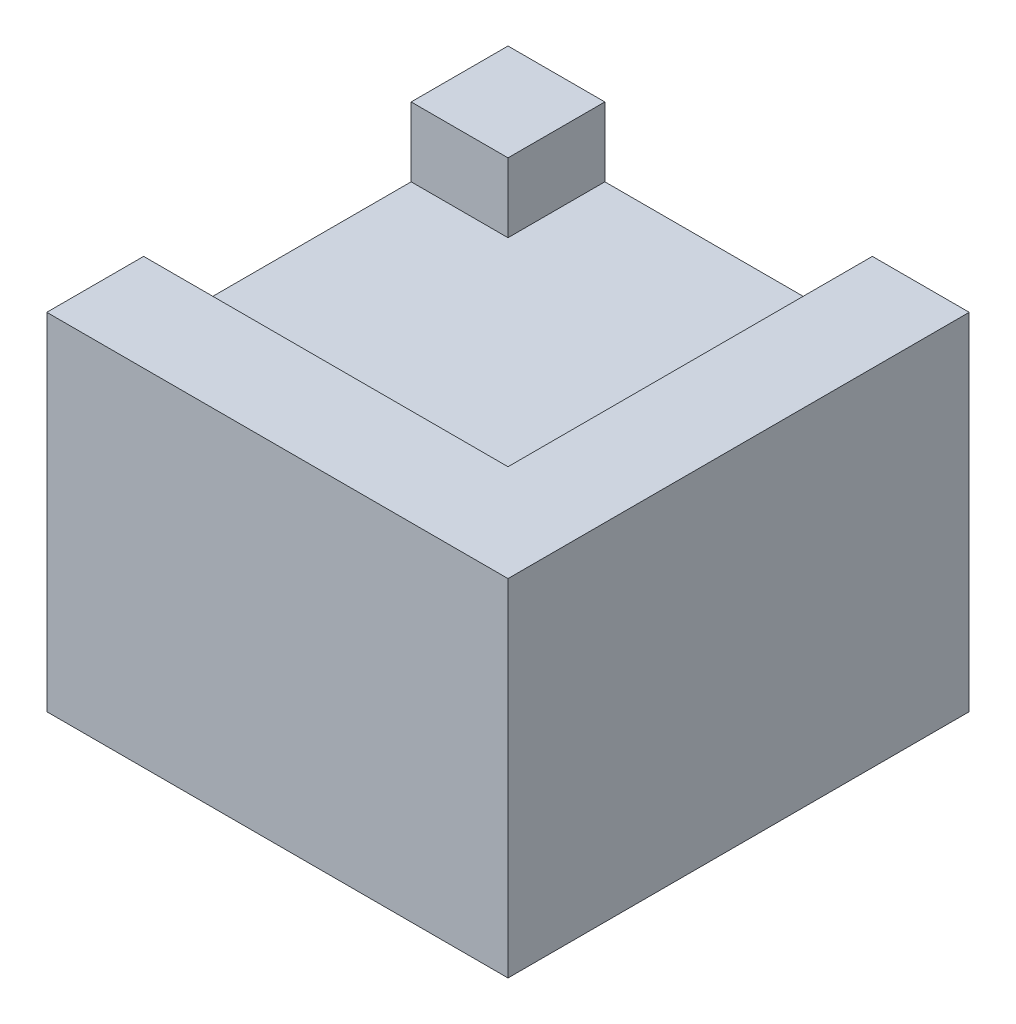
ISO-10303-21;
HEADER;
FILE_DESCRIPTION(('STEP AP214'),'2;1');
FILE_NAME('part.step','',(''),(''),'','','');
FILE_SCHEMA(('AUTOMOTIVE_DESIGN { 1 0 10303 214 1 1 1 1 }'));
ENDSEC;
DATA;
#1=APPLICATION_CONTEXT('core data for automotive mechanical design processes');
#2=APPLICATION_PROTOCOL_DEFINITION('international standard','automotive_design',2000,#1);
#3=PRODUCT_CONTEXT('',#1,'mechanical');
#4=PRODUCT('Part','Part','',(#3));
#5=PRODUCT_RELATED_PRODUCT_CATEGORY('part','',(#4));
#6=PRODUCT_DEFINITION_FORMATION('','',#4);
#7=PRODUCT_DEFINITION_CONTEXT('part definition',#1,'design');
#8=PRODUCT_DEFINITION('design','',#6,#7);
#9=PRODUCT_DEFINITION_SHAPE('','',#8);
#10=(LENGTH_UNIT() NAMED_UNIT(*) SI_UNIT(.MILLI.,.METRE.));
#11=(NAMED_UNIT(*) PLANE_ANGLE_UNIT() SI_UNIT($,.RADIAN.));
#12=(NAMED_UNIT(*) SI_UNIT($,.STERADIAN.) SOLID_ANGLE_UNIT());
#13=UNCERTAINTY_MEASURE_WITH_UNIT(LENGTH_MEASURE(1.E-05),#10,'distance_accuracy_value','');
#14=(GEOMETRIC_REPRESENTATION_CONTEXT(3) GLOBAL_UNCERTAINTY_ASSIGNED_CONTEXT((#13)) GLOBAL_UNIT_ASSIGNED_CONTEXT((#10,
#11,#12)) REPRESENTATION_CONTEXT('',''));
#15=CARTESIAN_POINT('',(0.,0.,0.));
#16=DIRECTION('',(0.,0.,1.));
#17=DIRECTION('',(1.,0.,0.));
#18=AXIS2_PLACEMENT_3D('',#15,#16,#17);
#19=CARTESIAN_POINT('',(0.,19.05,0.));
#20=DIRECTION('',(0.,1.,0.));
#21=DIRECTION('',(0.,0.,1.));
#22=AXIS2_PLACEMENT_3D('',#19,#20,#21);
#23=PLANE('',#22);
#24=DIRECTION('',(-1.,0.,0.));
#25=VECTOR('',#24,1.);
#26=CARTESIAN_POINT('',(-15.875,19.05,9.2075));
#27=LINE('',#26,#25);
#28=CARTESIAN_POINT('',(9.2075,19.05,9.2075));
#29=VERTEX_POINT('',#28);
#30=CARTESIAN_POINT('',(-15.875,19.05,9.2075));
#31=VERTEX_POINT('',#30);
#32=EDGE_CURVE('E137',#29,#31,#27,.T.);
#33=ORIENTED_EDGE('',*,*,#32,.F.);
#34=DIRECTION('',(0.,0.,1.));
#35=VECTOR('',#34,1.);
#36=CARTESIAN_POINT('',(9.2075,19.05,9.2075));
#37=LINE('',#36,#35);
#38=CARTESIAN_POINT('',(9.2075,19.05,-15.875));
#39=VERTEX_POINT('',#38);
#40=EDGE_CURVE('E139',#39,#29,#37,.T.);
#41=ORIENTED_EDGE('',*,*,#40,.F.);
#42=DIRECTION('',(-1.,0.,0.));
#43=VECTOR('',#42,1.);
#44=CARTESIAN_POINT('',(-15.875,19.05,-15.875));
#45=LINE('',#44,#43);
#46=CARTESIAN_POINT('',(-9.2075,19.05,-15.875));
#47=VERTEX_POINT('',#46);
#48=EDGE_CURVE('E177',#39,#47,#45,.T.);
#49=ORIENTED_EDGE('',*,*,#48,.T.);
#50=DIRECTION('',(0.,0.,-1.));
#51=VECTOR('',#50,1.);
#52=CARTESIAN_POINT('',(-9.2075,19.05,-15.875));
#53=LINE('',#52,#51);
#54=CARTESIAN_POINT('',(-9.2075,19.05,-9.2075));
#55=VERTEX_POINT('',#54);
#56=EDGE_CURVE('E158',#55,#47,#53,.T.);
#57=ORIENTED_EDGE('',*,*,#56,.F.);
#58=DIRECTION('',(1.,0.,0.));
#59=VECTOR('',#58,1.);
#60=CARTESIAN_POINT('',(-9.2075,19.05,-9.2075));
#61=LINE('',#60,#59);
#62=CARTESIAN_POINT('',(-15.875,19.05,-9.2075));
#63=VERTEX_POINT('',#62);
#64=EDGE_CURVE('E56',#63,#55,#61,.T.);
#65=ORIENTED_EDGE('',*,*,#64,.F.);
#66=DIRECTION('',(0.,0.,1.));
#67=VECTOR('',#66,1.);
#68=CARTESIAN_POINT('',(-15.875,19.05,-15.875));
#69=LINE('',#68,#67);
#70=EDGE_CURVE('E179',#63,#31,#69,.T.);
#71=ORIENTED_EDGE('',*,*,#70,.T.);
#72=EDGE_LOOP('',(#33,#41,#49,#57,#65,#71));
#73=FACE_BOUND('',#72,.T.);
#74=ADVANCED_FACE('F33',(#73),#23,.T.);
#75=CARTESIAN_POINT('',(15.875,19.05,-15.875));
#76=DIRECTION('',(-1.,0.,0.));
#77=DIRECTION('',(0.,0.,1.));
#78=AXIS2_PLACEMENT_3D('',#75,#76,#77);
#79=PLANE('',#78);
#80=DIRECTION('',(0.,0.,-1.));
#81=VECTOR('',#80,1.);
#82=CARTESIAN_POINT('',(15.875,0.,-15.875));
#83=LINE('',#82,#81);
#84=CARTESIAN_POINT('',(15.875,0.,15.875));
#85=VERTEX_POINT('',#84);
#86=CARTESIAN_POINT('',(15.875,0.,-15.875));
#87=VERTEX_POINT('',#86);
#88=EDGE_CURVE('E176',#85,#87,#83,.T.);
#89=ORIENTED_EDGE('',*,*,#88,.T.);
#90=DIRECTION('',(0.,-1.,0.));
#91=VECTOR('',#90,1.);
#92=CARTESIAN_POINT('',(15.875,19.05,-15.875));
#93=LINE('',#92,#91);
#94=CARTESIAN_POINT('',(15.875,23.8125,-15.875));
#95=VERTEX_POINT('',#94);
#96=EDGE_CURVE('E11',#95,#87,#93,.T.);
#97=ORIENTED_EDGE('',*,*,#96,.F.);
#98=DIRECTION('',(0.,0.,-1.));
#99=VECTOR('',#98,1.);
#100=CARTESIAN_POINT('',(15.875,23.8125,-15.875));
#101=LINE('',#100,#99);
#102=CARTESIAN_POINT('',(15.875,23.8125,15.875));
#103=VERTEX_POINT('',#102);
#104=EDGE_CURVE('E132',#103,#95,#101,.T.);
#105=ORIENTED_EDGE('',*,*,#104,.F.);
#106=DIRECTION('',(0.,-1.,0.));
#107=VECTOR('',#106,1.);
#108=CARTESIAN_POINT('',(15.875,19.05,15.875));
#109=LINE('',#108,#107);
#110=EDGE_CURVE('E123',#103,#85,#109,.T.);
#111=ORIENTED_EDGE('',*,*,#110,.T.);
#112=EDGE_LOOP('',(#89,#97,#105,#111));
#113=FACE_BOUND('',#112,.T.);
#114=ADVANCED_FACE('F35',(#113),#79,.F.);
#115=CARTESIAN_POINT('',(-15.875,19.05,-15.875));
#116=DIRECTION('',(0.,0.,1.));
#117=DIRECTION('',(1.,0.,0.));
#118=AXIS2_PLACEMENT_3D('',#115,#116,#117);
#119=PLANE('',#118);
#120=DIRECTION('',(-1.,0.,0.));
#121=VECTOR('',#120,1.);
#122=CARTESIAN_POINT('',(-15.875,0.,-15.875));
#123=LINE('',#122,#121);
#124=CARTESIAN_POINT('',(-15.875,0.,-15.875));
#125=VERTEX_POINT('',#124);
#126=EDGE_CURVE('E184',#87,#125,#123,.T.);
#127=ORIENTED_EDGE('',*,*,#126,.T.);
#128=DIRECTION('',(0.,-1.,0.));
#129=VECTOR('',#128,1.);
#130=CARTESIAN_POINT('',(-15.875,19.05,-15.875));
#131=LINE('',#130,#129);
#132=CARTESIAN_POINT('',(-15.875,23.8125,-15.875));
#133=VERTEX_POINT('',#132);
#134=EDGE_CURVE('E41',#133,#125,#131,.T.);
#135=ORIENTED_EDGE('',*,*,#134,.F.);
#136=DIRECTION('',(-1.,0.,0.));
#137=VECTOR('',#136,1.);
#138=CARTESIAN_POINT('',(-15.875,23.8125,-15.875));
#139=LINE('',#138,#137);
#140=CARTESIAN_POINT('',(-9.2075,23.8125,-15.875));
#141=VERTEX_POINT('',#140);
#142=EDGE_CURVE('E154',#141,#133,#139,.T.);
#143=ORIENTED_EDGE('',*,*,#142,.F.);
#144=DIRECTION('',(0.,-1.,0.));
#145=VECTOR('',#144,1.);
#146=CARTESIAN_POINT('',(-9.2075,23.8125,-15.875));
#147=LINE('',#146,#145);
#148=EDGE_CURVE('E164',#141,#47,#147,.T.);
#149=ORIENTED_EDGE('',*,*,#148,.T.);
#150=ORIENTED_EDGE('',*,*,#48,.F.);
#151=DIRECTION('',(0.,-1.,0.));
#152=VECTOR('',#151,1.);
#153=CARTESIAN_POINT('',(9.2075,23.8125,-15.875));
#154=LINE('',#153,#152);
#155=CARTESIAN_POINT('',(9.2075,23.8125,-15.875));
#156=VERTEX_POINT('',#155);
#157=EDGE_CURVE('E152',#156,#39,#154,.T.);
#158=ORIENTED_EDGE('',*,*,#157,.F.);
#159=DIRECTION('',(-1.,0.,0.));
#160=VECTOR('',#159,1.);
#161=CARTESIAN_POINT('',(9.2075,23.8125,-15.875));
#162=LINE('',#161,#160);
#163=EDGE_CURVE('E143',#95,#156,#162,.T.);
#164=ORIENTED_EDGE('',*,*,#163,.F.);
#165=ORIENTED_EDGE('',*,*,#96,.T.);
#166=EDGE_LOOP('',(#127,#135,#143,#149,#150,#158,#164,#165));
#167=FACE_BOUND('',#166,.T.);
#168=ADVANCED_FACE('F198',(#167),#119,.F.);
#169=CARTESIAN_POINT('',(-15.875,19.05,-15.875));
#170=DIRECTION('',(1.,0.,0.));
#171=DIRECTION('',(0.,0.,-1.));
#172=AXIS2_PLACEMENT_3D('',#169,#170,#171);
#173=PLANE('',#172);
#174=DIRECTION('',(0.,0.,1.));
#175=VECTOR('',#174,1.);
#176=CARTESIAN_POINT('',(-15.875,0.,-15.875));
#177=LINE('',#176,#175);
#178=CARTESIAN_POINT('',(-15.875,0.,15.875));
#179=VERTEX_POINT('',#178);
#180=EDGE_CURVE('E120',#125,#179,#177,.T.);
#181=ORIENTED_EDGE('',*,*,#180,.T.);
#182=DIRECTION('',(0.,-1.,0.));
#183=VECTOR('',#182,1.);
#184=CARTESIAN_POINT('',(-15.875,19.05,15.875));
#185=LINE('',#184,#183);
#186=CARTESIAN_POINT('',(-15.875,23.8125,15.875));
#187=VERTEX_POINT('',#186);
#188=EDGE_CURVE('E112',#187,#179,#185,.T.);
#189=ORIENTED_EDGE('',*,*,#188,.F.);
#190=DIRECTION('',(0.,0.,1.));
#191=VECTOR('',#190,1.);
#192=CARTESIAN_POINT('',(-15.875,23.8125,15.875));
#193=LINE('',#192,#191);
#194=CARTESIAN_POINT('',(-15.875,23.8125,9.2075));
#195=VERTEX_POINT('',#194);
#196=EDGE_CURVE('E117',#195,#187,#193,.T.);
#197=ORIENTED_EDGE('',*,*,#196,.F.);
#198=DIRECTION('',(0.,-1.,0.));
#199=VECTOR('',#198,1.);
#200=CARTESIAN_POINT('',(-15.875,23.8125,9.2075));
#201=LINE('',#200,#199);
#202=EDGE_CURVE('E148',#195,#31,#201,.T.);
#203=ORIENTED_EDGE('',*,*,#202,.T.);
#204=ORIENTED_EDGE('',*,*,#70,.F.);
#205=DIRECTION('',(0.,-1.,0.));
#206=VECTOR('',#205,1.);
#207=CARTESIAN_POINT('',(-15.875,23.8125,-9.2075));
#208=LINE('',#207,#206);
#209=CARTESIAN_POINT('',(-15.875,23.8125,-9.2075));
#210=VERTEX_POINT('',#209);
#211=EDGE_CURVE('E173',#210,#63,#208,.T.);
#212=ORIENTED_EDGE('',*,*,#211,.F.);
#213=DIRECTION('',(0.,0.,1.));
#214=VECTOR('',#213,1.);
#215=CARTESIAN_POINT('',(-15.875,23.8125,-9.2075));
#216=LINE('',#215,#214);
#217=EDGE_CURVE('E157',#133,#210,#216,.T.);
#218=ORIENTED_EDGE('',*,*,#217,.F.);
#219=ORIENTED_EDGE('',*,*,#134,.T.);
#220=EDGE_LOOP('',(#181,#189,#197,#203,#204,#212,#218,#219));
#221=FACE_BOUND('',#220,.T.);
#222=ADVANCED_FACE('F114',(#221),#173,.F.);
#223=CARTESIAN_POINT('',(-15.875,19.05,15.875));
#224=DIRECTION('',(0.,0.,-1.));
#225=DIRECTION('',(-1.,0.,0.));
#226=AXIS2_PLACEMENT_3D('',#223,#224,#225);
#227=PLANE('',#226);
#228=DIRECTION('',(1.,0.,0.));
#229=VECTOR('',#228,1.);
#230=CARTESIAN_POINT('',(-15.875,0.,15.875));
#231=LINE('',#230,#229);
#232=EDGE_CURVE('E180',#179,#85,#231,.T.);
#233=ORIENTED_EDGE('',*,*,#232,.T.);
#234=ORIENTED_EDGE('',*,*,#110,.F.);
#235=DIRECTION('',(1.,0.,0.));
#236=VECTOR('',#235,1.);
#237=CARTESIAN_POINT('',(15.875,23.8125,15.875));
#238=LINE('',#237,#236);
#239=EDGE_CURVE('E126',#187,#103,#238,.T.);
#240=ORIENTED_EDGE('',*,*,#239,.F.);
#241=ORIENTED_EDGE('',*,*,#188,.T.);
#242=EDGE_LOOP('',(#233,#234,#240,#241));
#243=FACE_BOUND('',#242,.T.);
#244=ADVANCED_FACE('F127',(#243),#227,.F.);
#245=CARTESIAN_POINT('',(0.,0.,0.));
#246=DIRECTION('',(0.,1.,0.));
#247=DIRECTION('',(0.,0.,1.));
#248=AXIS2_PLACEMENT_3D('',#245,#246,#247);
#249=PLANE('',#248);
#250=ORIENTED_EDGE('',*,*,#88,.F.);
#251=ORIENTED_EDGE('',*,*,#232,.F.);
#252=ORIENTED_EDGE('',*,*,#180,.F.);
#253=ORIENTED_EDGE('',*,*,#126,.F.);
#254=EDGE_LOOP('',(#250,#251,#252,#253));
#255=FACE_BOUND('',#254,.T.);
#256=ADVANCED_FACE('F194',(#255),#249,.F.);
#257=CARTESIAN_POINT('',(-9.2075,23.8125,-9.2075));
#258=DIRECTION('',(0.,0.,-1.));
#259=DIRECTION('',(-1.,0.,0.));
#260=AXIS2_PLACEMENT_3D('',#257,#258,#259);
#261=PLANE('',#260);
#262=ORIENTED_EDGE('',*,*,#64,.T.);
#263=DIRECTION('',(0.,-1.,0.));
#264=VECTOR('',#263,1.);
#265=CARTESIAN_POINT('',(-9.2075,23.8125,-9.2075));
#266=LINE('',#265,#264);
#267=CARTESIAN_POINT('',(-9.2075,23.8125,-9.2075));
#268=VERTEX_POINT('',#267);
#269=EDGE_CURVE('E170',#268,#55,#266,.T.);
#270=ORIENTED_EDGE('',*,*,#269,.F.);
#271=DIRECTION('',(1.,0.,0.));
#272=VECTOR('',#271,1.);
#273=CARTESIAN_POINT('',(-9.2075,23.8125,-9.2075));
#274=LINE('',#273,#272);
#275=EDGE_CURVE('E160',#210,#268,#274,.T.);
#276=ORIENTED_EDGE('',*,*,#275,.F.);
#277=ORIENTED_EDGE('',*,*,#211,.T.);
#278=EDGE_LOOP('',(#262,#270,#276,#277));
#279=FACE_BOUND('',#278,.T.);
#280=ADVANCED_FACE('F215',(#279),#261,.F.);
#281=CARTESIAN_POINT('',(-9.2075,23.8125,-15.875));
#282=DIRECTION('',(-1.,0.,0.));
#283=DIRECTION('',(0.,0.,1.));
#284=AXIS2_PLACEMENT_3D('',#281,#282,#283);
#285=PLANE('',#284);
#286=ORIENTED_EDGE('',*,*,#56,.T.);
#287=ORIENTED_EDGE('',*,*,#148,.F.);
#288=DIRECTION('',(0.,0.,-1.));
#289=VECTOR('',#288,1.);
#290=CARTESIAN_POINT('',(-9.2075,23.8125,-15.875));
#291=LINE('',#290,#289);
#292=EDGE_CURVE('E162',#268,#141,#291,.T.);
#293=ORIENTED_EDGE('',*,*,#292,.F.);
#294=ORIENTED_EDGE('',*,*,#269,.T.);
#295=EDGE_LOOP('',(#286,#287,#293,#294));
#296=FACE_BOUND('',#295,.T.);
#297=ADVANCED_FACE('F208',(#296),#285,.F.);
#298=CARTESIAN_POINT('',(0.,23.8125,0.));
#299=DIRECTION('',(0.,-1.,0.));
#300=DIRECTION('',(0.,0.,-1.));
#301=AXIS2_PLACEMENT_3D('',#298,#299,#300);
#302=PLANE('',#301);
#303=ORIENTED_EDGE('',*,*,#142,.T.);
#304=ORIENTED_EDGE('',*,*,#217,.T.);
#305=ORIENTED_EDGE('',*,*,#275,.T.);
#306=ORIENTED_EDGE('',*,*,#292,.T.);
#307=EDGE_LOOP('',(#303,#304,#305,#306));
#308=FACE_BOUND('',#307,.T.);
#309=ADVANCED_FACE('F212',(#308),#302,.F.);
#310=CARTESIAN_POINT('',(9.2075,23.8125,9.2075));
#311=DIRECTION('',(1.,0.,0.));
#312=DIRECTION('',(0.,0.,-1.));
#313=AXIS2_PLACEMENT_3D('',#310,#311,#312);
#314=PLANE('',#313);
#315=ORIENTED_EDGE('',*,*,#40,.T.);
#316=DIRECTION('',(0.,-1.,0.));
#317=VECTOR('',#316,1.);
#318=CARTESIAN_POINT('',(9.2075,23.8125,9.2075));
#319=LINE('',#318,#317);
#320=CARTESIAN_POINT('',(9.2075,23.8125,9.2075));
#321=VERTEX_POINT('',#320);
#322=EDGE_CURVE('E48',#321,#29,#319,.T.);
#323=ORIENTED_EDGE('',*,*,#322,.F.);
#324=DIRECTION('',(0.,0.,1.));
#325=VECTOR('',#324,1.);
#326=CARTESIAN_POINT('',(9.2075,23.8125,9.2075));
#327=LINE('',#326,#325);
#328=EDGE_CURVE('E145',#156,#321,#327,.T.);
#329=ORIENTED_EDGE('',*,*,#328,.F.);
#330=ORIENTED_EDGE('',*,*,#157,.T.);
#331=EDGE_LOOP('',(#315,#323,#329,#330));
#332=FACE_BOUND('',#331,.T.);
#333=ADVANCED_FACE('F203',(#332),#314,.F.);
#334=CARTESIAN_POINT('',(-15.875,23.8125,9.2075));
#335=DIRECTION('',(0.,0.,1.));
#336=DIRECTION('',(1.,0.,0.));
#337=AXIS2_PLACEMENT_3D('',#334,#335,#336);
#338=PLANE('',#337);
#339=ORIENTED_EDGE('',*,*,#32,.T.);
#340=ORIENTED_EDGE('',*,*,#202,.F.);
#341=DIRECTION('',(-1.,0.,0.));
#342=VECTOR('',#341,1.);
#343=CARTESIAN_POINT('',(-15.875,23.8125,9.2075));
#344=LINE('',#343,#342);
#345=EDGE_CURVE('E135',#321,#195,#344,.T.);
#346=ORIENTED_EDGE('',*,*,#345,.F.);
#347=ORIENTED_EDGE('',*,*,#322,.T.);
#348=EDGE_LOOP('',(#339,#340,#346,#347));
#349=FACE_BOUND('',#348,.T.);
#350=ADVANCED_FACE('F205',(#349),#338,.F.);
#351=CARTESIAN_POINT('',(0.,23.8125,0.));
#352=DIRECTION('',(0.,-1.,0.));
#353=DIRECTION('',(0.,0.,-1.));
#354=AXIS2_PLACEMENT_3D('',#351,#352,#353);
#355=PLANE('',#354);
#356=ORIENTED_EDGE('',*,*,#196,.T.);
#357=ORIENTED_EDGE('',*,*,#239,.T.);
#358=ORIENTED_EDGE('',*,*,#104,.T.);
#359=ORIENTED_EDGE('',*,*,#163,.T.);
#360=ORIENTED_EDGE('',*,*,#328,.T.);
#361=ORIENTED_EDGE('',*,*,#345,.T.);
#362=EDGE_LOOP('',(#356,#357,#358,#359,#360,#361));
#363=FACE_BOUND('',#362,.T.);
#364=ADVANCED_FACE('F134',(#363),#355,.F.);
#365=CLOSED_SHELL('',(#74,#114,#168,#222,#244,#256,#280,#297,#309,#333,#350,#364));
#366=MANIFOLD_SOLID_BREP('B2',#365);
#367=ADVANCED_BREP_SHAPE_REPRESENTATION('',(#18,#366),#14);
#368=SHAPE_DEFINITION_REPRESENTATION(#9,#367);
ENDSEC;
END-ISO-10303-21;
